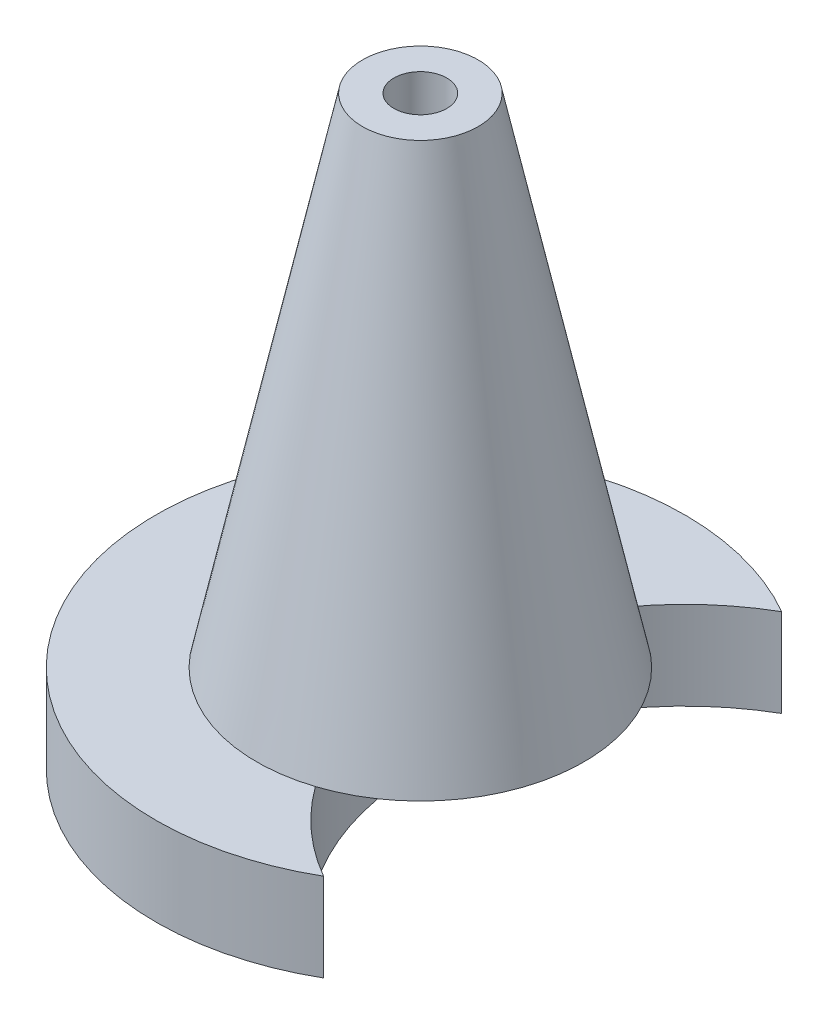
ISO-10303-21;
HEADER;
FILE_DESCRIPTION(('STEP AP214'),'2;1');
FILE_NAME('part.step','',(''),(''),'','','');
FILE_SCHEMA(('AUTOMOTIVE_DESIGN { 1 0 10303 214 1 1 1 1 }'));
ENDSEC;
DATA;
#1=APPLICATION_CONTEXT('core data for automotive mechanical design processes');
#2=APPLICATION_PROTOCOL_DEFINITION('international standard','automotive_design',2000,#1);
#3=PRODUCT_CONTEXT('',#1,'mechanical');
#4=PRODUCT('Part','Part','',(#3));
#5=PRODUCT_RELATED_PRODUCT_CATEGORY('part','',(#4));
#6=PRODUCT_DEFINITION_FORMATION('','',#4);
#7=PRODUCT_DEFINITION_CONTEXT('part definition',#1,'design');
#8=PRODUCT_DEFINITION('design','',#6,#7);
#9=PRODUCT_DEFINITION_SHAPE('','',#8);
#10=(LENGTH_UNIT() NAMED_UNIT(*) SI_UNIT(.MILLI.,.METRE.));
#11=(NAMED_UNIT(*) PLANE_ANGLE_UNIT() SI_UNIT($,.RADIAN.));
#12=(NAMED_UNIT(*) SI_UNIT($,.STERADIAN.) SOLID_ANGLE_UNIT());
#13=UNCERTAINTY_MEASURE_WITH_UNIT(LENGTH_MEASURE(1.E-05),#10,'distance_accuracy_value','');
#14=(GEOMETRIC_REPRESENTATION_CONTEXT(3) GLOBAL_UNCERTAINTY_ASSIGNED_CONTEXT((#13)) GLOBAL_UNIT_ASSIGNED_CONTEXT((#10,
#11,#12)) REPRESENTATION_CONTEXT('',''));
#15=CARTESIAN_POINT('',(0.,0.,0.));
#16=DIRECTION('',(0.,0.,1.));
#17=DIRECTION('',(1.,0.,0.));
#18=AXIS2_PLACEMENT_3D('',#15,#16,#17);
#19=CARTESIAN_POINT('',(0.,56.41,0.));
#20=DIRECTION('',(0.,1.,0.));
#21=DIRECTION('',(0.,0.,1.));
#22=AXIS2_PLACEMENT_3D('',#19,#20,#21);
#23=PLANE('',#22);
#24=CARTESIAN_POINT('',(0.,56.41,0.));
#25=DIRECTION('',(0.,1.,0.));
#26=DIRECTION('',(0.,0.,1.));
#27=AXIS2_PLACEMENT_3D('',#24,#25,#26);
#28=CIRCLE('',#27,3.);
#29=CARTESIAN_POINT('',(0.,56.41,3.));
#30=VERTEX_POINT('',#29);
#31=EDGE_CURVE('E144',#30,#30,#28,.T.);
#32=ORIENTED_EDGE('',*,*,#31,.F.);
#33=EDGE_LOOP('',(#32));
#34=FACE_BOUND('',#33,.T.);
#35=CARTESIAN_POINT('',(0.,56.41,0.));
#36=DIRECTION('',(0.,1.,0.));
#37=DIRECTION('',(0.,0.,1.));
#38=AXIS2_PLACEMENT_3D('',#35,#36,#37);
#39=CIRCLE('',#38,6.56);
#40=CARTESIAN_POINT('',(0.,56.41,6.56));
#41=VERTEX_POINT('',#40);
#42=EDGE_CURVE('E44',#41,#41,#39,.T.);
#43=ORIENTED_EDGE('',*,*,#42,.T.);
#44=EDGE_LOOP('',(#43));
#45=FACE_BOUND('',#44,.T.);
#46=ADVANCED_FACE('F35',(#34,#45),#23,.T.);
#47=CARTESIAN_POINT('',(0.,56.41,0.));
#48=DIRECTION('',(0.,-1.,0.));
#49=DIRECTION('',(0.,0.,-1.));
#50=AXIS2_PLACEMENT_3D('',#47,#48,#49);
#51=CONICAL_SURFACE('',#50,6.56,0.209434156583422);
#52=ORIENTED_EDGE('',*,*,#42,.F.);
#53=EDGE_LOOP('',(#52));
#54=FACE_BOUND('',#53,.T.);
#55=CARTESIAN_POINT('',(0.,0.,0.));
#56=DIRECTION('',(0.,1.,0.));
#57=DIRECTION('',(0.,0.,1.));
#58=AXIS2_PLACEMENT_3D('',#55,#56,#57);
#59=CIRCLE('',#58,18.55);
#60=CARTESIAN_POINT('',(5.73504166666667,0.,17.6411960218574));
#61=VERTEX_POINT('',#60);
#62=CARTESIAN_POINT('',(5.73504166666667,0.,-17.6411960218574));
#63=VERTEX_POINT('',#62);
#64=EDGE_CURVE('E88',#61,#63,#59,.T.);
#65=ORIENTED_EDGE('',*,*,#64,.T.);
#66=EDGE_CURVE('E85',#63,#61,#59,.T.);
#67=ORIENTED_EDGE('',*,*,#66,.T.);
#68=EDGE_LOOP('',(#65,#67));
#69=FACE_BOUND('',#68,.T.);
#70=ADVANCED_FACE('F37',(#54,#69),#51,.T.);
#71=CARTESIAN_POINT('',(0.,-10.,0.));
#72=DIRECTION('',(0.,1.,0.));
#73=DIRECTION('',(0.,0.,1.));
#74=AXIS2_PLACEMENT_3D('',#71,#72,#73);
#75=CYLINDRICAL_SURFACE('',#74,30.);
#76=DIRECTION('',(0.,1.,0.));
#77=VECTOR('',#76,1.);
#78=CARTESIAN_POINT('',(15.,-10.,-25.9807621135332));
#79=LINE('',#78,#77);
#80=CARTESIAN_POINT('',(15.,-10.,-25.9807621135332));
#81=VERTEX_POINT('',#80);
#82=CARTESIAN_POINT('',(15.,0.,-25.9807621135332));
#83=VERTEX_POINT('',#82);
#84=EDGE_CURVE('E68',#81,#83,#79,.T.);
#85=ORIENTED_EDGE('',*,*,#84,.F.);
#86=CARTESIAN_POINT('',(0.,-10.,0.));
#87=DIRECTION('',(0.,1.,0.));
#88=DIRECTION('',(0.,0.,1.));
#89=AXIS2_PLACEMENT_3D('',#86,#87,#88);
#90=CIRCLE('',#89,30.);
#91=CARTESIAN_POINT('',(15.,-10.,25.9807621135332));
#92=VERTEX_POINT('',#91);
#93=EDGE_CURVE('E80',#81,#92,#90,.T.);
#94=ORIENTED_EDGE('',*,*,#93,.T.);
#95=DIRECTION('',(0.,1.,0.));
#96=VECTOR('',#95,1.);
#97=CARTESIAN_POINT('',(15.,-10.,25.9807621135332));
#98=LINE('',#97,#96);
#99=CARTESIAN_POINT('',(15.,0.,25.9807621135332));
#100=VERTEX_POINT('',#99);
#101=EDGE_CURVE('E71',#92,#100,#98,.T.);
#102=ORIENTED_EDGE('',*,*,#101,.T.);
#103=CARTESIAN_POINT('',(0.,0.,0.));
#104=DIRECTION('',(0.,1.,0.));
#105=DIRECTION('',(0.,0.,1.));
#106=AXIS2_PLACEMENT_3D('',#103,#104,#105);
#107=CIRCLE('',#106,30.);
#108=EDGE_CURVE('E82',#83,#100,#107,.T.);
#109=ORIENTED_EDGE('',*,*,#108,.F.);
#110=EDGE_LOOP('',(#85,#94,#102,#109));
#111=FACE_BOUND('',#110,.T.);
#112=ADVANCED_FACE('F79',(#111),#75,.T.);
#113=CARTESIAN_POINT('',(0.,-10.,0.));
#114=DIRECTION('',(0.,1.,0.));
#115=DIRECTION('',(0.,0.,1.));
#116=AXIS2_PLACEMENT_3D('',#113,#114,#115);
#117=PLANE('',#116);
#118=ORIENTED_EDGE('',*,*,#93,.F.);
#119=CARTESIAN_POINT('',(30.,-10.,0.));
#120=DIRECTION('',(0.,1.,0.));
#121=DIRECTION('',(0.,0.,1.));
#122=AXIS2_PLACEMENT_3D('',#119,#120,#121);
#123=CIRCLE('',#122,30.);
#124=EDGE_CURVE('E65',#81,#92,#123,.T.);
#125=ORIENTED_EDGE('',*,*,#124,.T.);
#126=EDGE_LOOP('',(#118,#125));
#127=FACE_BOUND('',#126,.T.);
#128=ADVANCED_FACE('F84',(#127),#117,.F.);
#129=CARTESIAN_POINT('',(0.,0.,0.));
#130=DIRECTION('',(0.,1.,0.));
#131=DIRECTION('',(0.,0.,1.));
#132=AXIS2_PLACEMENT_3D('',#129,#130,#131);
#133=PLANE('',#132);
#134=CARTESIAN_POINT('',(30.,0.,0.));
#135=DIRECTION('',(0.,1.,0.));
#136=DIRECTION('',(0.,0.,1.));
#137=AXIS2_PLACEMENT_3D('',#134,#135,#136);
#138=CIRCLE('',#137,30.);
#139=EDGE_CURVE('E75',#83,#63,#138,.T.);
#140=ORIENTED_EDGE('',*,*,#139,.F.);
#141=ORIENTED_EDGE('',*,*,#108,.T.);
#142=CARTESIAN_POINT('',(30.,0.,0.));
#143=DIRECTION('',(0.,1.,0.));
#144=DIRECTION('',(0.,0.,1.));
#145=AXIS2_PLACEMENT_3D('',#142,#143,#144);
#146=CIRCLE('',#145,30.);
#147=EDGE_CURVE('E12',#61,#100,#146,.T.);
#148=ORIENTED_EDGE('',*,*,#147,.F.);
#149=ORIENTED_EDGE('',*,*,#66,.F.);
#150=EDGE_LOOP('',(#140,#141,#148,#149));
#151=FACE_BOUND('',#150,.T.);
#152=ADVANCED_FACE('F121',(#151),#133,.T.);
#153=CARTESIAN_POINT('',(30.,-10.,0.));
#154=DIRECTION('',(0.,1.,0.));
#155=DIRECTION('',(0.,0.,1.));
#156=AXIS2_PLACEMENT_3D('',#153,#154,#155);
#157=CYLINDRICAL_SURFACE('',#156,30.);
#158=ORIENTED_EDGE('',*,*,#139,.T.);
#159=EDGE_CURVE('E50',#63,#61,#138,.T.);
#160=ORIENTED_EDGE('',*,*,#159,.T.);
#161=ORIENTED_EDGE('',*,*,#147,.T.);
#162=ORIENTED_EDGE('',*,*,#101,.F.);
#163=ORIENTED_EDGE('',*,*,#124,.F.);
#164=ORIENTED_EDGE('',*,*,#84,.T.);
#165=EDGE_LOOP('',(#158,#160,#161,#162,#163,#164));
#166=FACE_BOUND('',#165,.T.);
#167=ADVANCED_FACE('F67',(#166),#157,.F.);
#168=CARTESIAN_POINT('',(0.,0.,0.));
#169=DIRECTION('',(0.,1.,0.));
#170=DIRECTION('',(0.,0.,1.));
#171=AXIS2_PLACEMENT_3D('',#168,#169,#170);
#172=PLANE('',#171);
#173=ORIENTED_EDGE('',*,*,#64,.F.);
#174=ORIENTED_EDGE('',*,*,#159,.F.);
#175=EDGE_LOOP('',(#173,#174));
#176=FACE_BOUND('',#175,.T.);
#177=ADVANCED_FACE('F129',(#176),#172,.F.);
#178=CARTESIAN_POINT('',(0.,34.41,0.));
#179=DIRECTION('',(0.,1.,0.));
#180=DIRECTION('',(0.,0.,1.));
#181=AXIS2_PLACEMENT_3D('',#178,#179,#180);
#182=CYLINDRICAL_SURFACE('',#181,3.);
#183=CARTESIAN_POINT('',(0.,34.41,0.));
#184=DIRECTION('',(0.,1.,0.));
#185=DIRECTION('',(0.,0.,1.));
#186=AXIS2_PLACEMENT_3D('',#183,#184,#185);
#187=CIRCLE('',#186,3.);
#188=CARTESIAN_POINT('',(0.,34.41,3.));
#189=VERTEX_POINT('',#188);
#190=EDGE_CURVE('E143',#189,#189,#187,.T.);
#191=ORIENTED_EDGE('',*,*,#190,.F.);
#192=EDGE_LOOP('',(#191));
#193=FACE_BOUND('',#192,.T.);
#194=ORIENTED_EDGE('',*,*,#31,.T.);
#195=EDGE_LOOP('',(#194));
#196=FACE_BOUND('',#195,.T.);
#197=ADVANCED_FACE('F132',(#193,#196),#182,.F.);
#198=CARTESIAN_POINT('',(0.,34.41,0.));
#199=DIRECTION('',(0.,1.,0.));
#200=DIRECTION('',(0.,0.,1.));
#201=AXIS2_PLACEMENT_3D('',#198,#199,#200);
#202=PLANE('',#201);
#203=ORIENTED_EDGE('',*,*,#190,.T.);
#204=EDGE_LOOP('',(#203));
#205=FACE_BOUND('',#204,.T.);
#206=ADVANCED_FACE('F135',(#205),#202,.T.);
#207=CLOSED_SHELL('',(#46,#70,#112,#128,#152,#167,#177,#197,#206));
#208=MANIFOLD_SOLID_BREP('B2',#207);
#209=ADVANCED_BREP_SHAPE_REPRESENTATION('',(#18,#208),#14);
#210=SHAPE_DEFINITION_REPRESENTATION(#9,#209);
ENDSEC;
END-ISO-10303-21;
